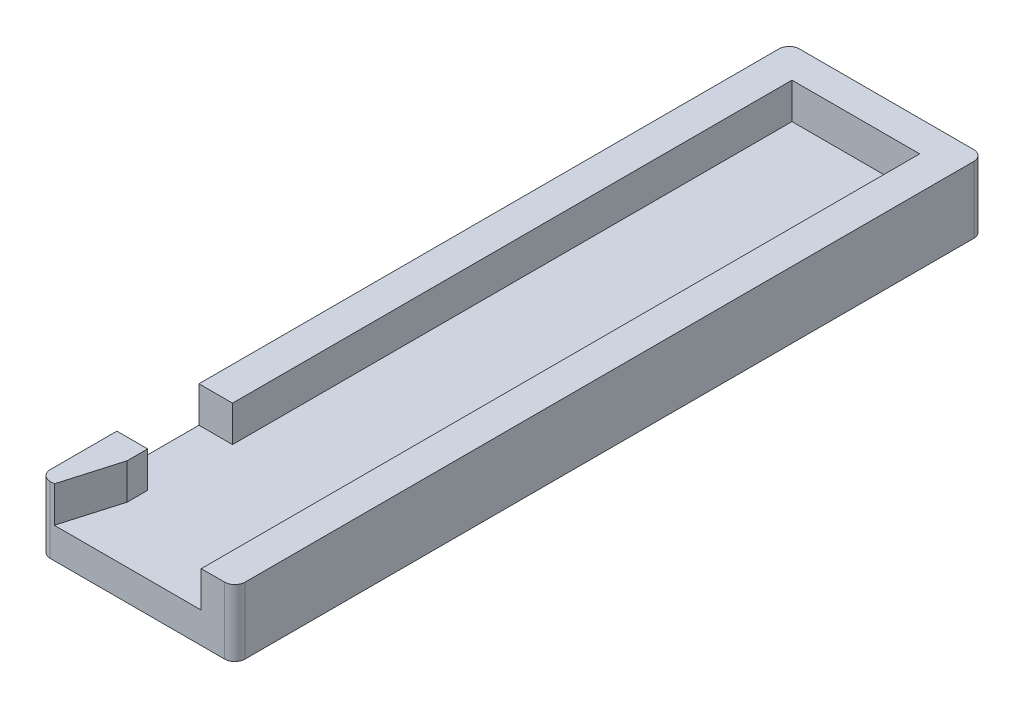
ISO-10303-21;
HEADER;
FILE_DESCRIPTION(('STEP AP214'),'2;1');
FILE_NAME('part.step','',(''),(''),'','','');
FILE_SCHEMA(('AUTOMOTIVE_DESIGN { 1 0 10303 214 1 1 1 1 }'));
ENDSEC;
DATA;
#1=APPLICATION_CONTEXT('core data for automotive mechanical design processes');
#2=APPLICATION_PROTOCOL_DEFINITION('international standard','automotive_design',2000,#1);
#3=PRODUCT_CONTEXT('',#1,'mechanical');
#4=PRODUCT('Part','Part','',(#3));
#5=PRODUCT_RELATED_PRODUCT_CATEGORY('part','',(#4));
#6=PRODUCT_DEFINITION_FORMATION('','',#4);
#7=PRODUCT_DEFINITION_CONTEXT('part definition',#1,'design');
#8=PRODUCT_DEFINITION('design','',#6,#7);
#9=PRODUCT_DEFINITION_SHAPE('','',#8);
#10=(LENGTH_UNIT() NAMED_UNIT(*) SI_UNIT(.MILLI.,.METRE.));
#11=(NAMED_UNIT(*) PLANE_ANGLE_UNIT() SI_UNIT($,.RADIAN.));
#12=(NAMED_UNIT(*) SI_UNIT($,.STERADIAN.) SOLID_ANGLE_UNIT());
#13=UNCERTAINTY_MEASURE_WITH_UNIT(LENGTH_MEASURE(1.E-05),#10,'distance_accuracy_value','');
#14=(GEOMETRIC_REPRESENTATION_CONTEXT(3) GLOBAL_UNCERTAINTY_ASSIGNED_CONTEXT((#13)) GLOBAL_UNIT_ASSIGNED_CONTEXT((#10,
#11,#12)) REPRESENTATION_CONTEXT('',''));
#15=CARTESIAN_POINT('',(0.,0.,0.));
#16=DIRECTION('',(0.,0.,1.));
#17=DIRECTION('',(1.,0.,0.));
#18=AXIS2_PLACEMENT_3D('',#15,#16,#17);
#19=CARTESIAN_POINT('',(0.,3.,0.));
#20=DIRECTION('',(0.,1.,0.));
#21=DIRECTION('',(0.,0.,1.));
#22=AXIS2_PLACEMENT_3D('',#19,#20,#21);
#23=PLANE('',#22);
#24=DIRECTION('',(0.,0.,-1.));
#25=VECTOR('',#24,1.);
#26=CARTESIAN_POINT('',(3.275,3.,-15.5));
#27=LINE('',#26,#25);
#28=CARTESIAN_POINT('',(3.275,3.,-15.5));
#29=VERTEX_POINT('',#28);
#30=CARTESIAN_POINT('',(3.275,3.,-70.05));
#31=VERTEX_POINT('',#30);
#32=EDGE_CURVE('E324',#29,#31,#27,.T.);
#33=ORIENTED_EDGE('',*,*,#32,.F.);
#34=DIRECTION('',(1.,0.,0.));
#35=VECTOR('',#34,1.);
#36=CARTESIAN_POINT('',(0.,3.,-15.5));
#37=LINE('',#36,#35);
#38=CARTESIAN_POINT('',(0.,3.,-15.5));
#39=VERTEX_POINT('',#38);
#40=EDGE_CURVE('E234',#39,#29,#37,.T.);
#41=ORIENTED_EDGE('',*,*,#40,.F.);
#42=DIRECTION('',(0.,0.,1.));
#43=VECTOR('',#42,1.);
#44=CARTESIAN_POINT('',(0.,3.,-73.05));
#45=LINE('',#44,#43);
#46=CARTESIAN_POINT('',(0.,3.,-7.50000000000001));
#47=VERTEX_POINT('',#46);
#48=EDGE_CURVE('E257',#39,#47,#45,.T.);
#49=ORIENTED_EDGE('',*,*,#48,.T.);
#50=DIRECTION('',(-1.,0.,0.));
#51=VECTOR('',#50,1.);
#52=CARTESIAN_POINT('',(3.,3.,-7.5));
#53=LINE('',#52,#51);
#54=CARTESIAN_POINT('',(3.,3.,-7.5));
#55=VERTEX_POINT('',#54);
#56=EDGE_CURVE('E216',#55,#47,#53,.T.);
#57=ORIENTED_EDGE('',*,*,#56,.F.);
#58=DIRECTION('',(0.,0.,-1.));
#59=VECTOR('',#58,1.);
#60=CARTESIAN_POINT('',(3.,3.,-5.5));
#61=LINE('',#60,#59);
#62=CARTESIAN_POINT('',(3.,3.,-5.5));
#63=VERTEX_POINT('',#62);
#64=EDGE_CURVE('E233',#63,#55,#61,.T.);
#65=ORIENTED_EDGE('',*,*,#64,.F.);
#66=DIRECTION('',(0.279329540830131,0.,-0.960195296603575));
#67=VECTOR('',#66,1.);
#68=CARTESIAN_POINT('',(1.4,3.,0.));
#69=LINE('',#68,#67);
#70=CARTESIAN_POINT('',(1.4,3.,0.));
#71=VERTEX_POINT('',#70);
#72=EDGE_CURVE('E229',#71,#63,#69,.T.);
#73=ORIENTED_EDGE('',*,*,#72,.F.);
#74=DIRECTION('',(1.,0.,0.));
#75=VECTOR('',#74,1.);
#76=CARTESIAN_POINT('',(0.,3.,0.));
#77=LINE('',#76,#75);
#78=CARTESIAN_POINT('',(15.725,3.,0.));
#79=VERTEX_POINT('',#78);
#80=EDGE_CURVE('E260',#71,#79,#77,.T.);
#81=ORIENTED_EDGE('',*,*,#80,.T.);
#82=DIRECTION('',(0.,0.,1.));
#83=VECTOR('',#82,1.);
#84=CARTESIAN_POINT('',(15.725,3.,-70.05));
#85=LINE('',#84,#83);
#86=CARTESIAN_POINT('',(15.725,3.,-70.05));
#87=VERTEX_POINT('',#86);
#88=EDGE_CURVE('E184',#87,#79,#85,.T.);
#89=ORIENTED_EDGE('',*,*,#88,.F.);
#90=DIRECTION('',(1.,0.,0.));
#91=VECTOR('',#90,1.);
#92=CARTESIAN_POINT('',(3.275,3.,-70.05));
#93=LINE('',#92,#91);
#94=EDGE_CURVE('E328',#31,#87,#93,.T.);
#95=ORIENTED_EDGE('',*,*,#94,.F.);
#96=EDGE_LOOP('',(#33,#41,#49,#57,#65,#73,#81,#89,#95));
#97=FACE_BOUND('',#96,.T.);
#98=ADVANCED_FACE('F45',(#97),#23,.T.);
#99=CARTESIAN_POINT('',(0.,3.,-73.05));
#100=DIRECTION('',(1.,0.,0.));
#101=DIRECTION('',(0.,0.,-1.));
#102=AXIS2_PLACEMENT_3D('',#99,#100,#101);
#103=PLANE('',#102);
#104=DIRECTION('',(0.,0.,1.));
#105=VECTOR('',#104,1.);
#106=CARTESIAN_POINT('',(0.,6.5,-73.05));
#107=LINE('',#106,#105);
#108=CARTESIAN_POINT('',(0.,6.5,-72.05));
#109=VERTEX_POINT('',#108);
#110=CARTESIAN_POINT('',(0.,6.5,-15.5));
#111=VERTEX_POINT('',#110);
#112=EDGE_CURVE('E209',#109,#111,#107,.T.);
#113=ORIENTED_EDGE('',*,*,#112,.F.);
#114=DIRECTION('',(0.,-1.,0.));
#115=VECTOR('',#114,1.);
#116=CARTESIAN_POINT('',(0.,3.,-72.05));
#117=LINE('',#116,#115);
#118=CARTESIAN_POINT('',(0.,0.,-72.05));
#119=VERTEX_POINT('',#118);
#120=EDGE_CURVE('E279',#109,#119,#117,.T.);
#121=ORIENTED_EDGE('',*,*,#120,.T.);
#122=DIRECTION('',(0.,0.,1.));
#123=VECTOR('',#122,1.);
#124=CARTESIAN_POINT('',(0.,0.,-73.05));
#125=LINE('',#124,#123);
#126=CARTESIAN_POINT('',(0.,0.,-1.));
#127=VERTEX_POINT('',#126);
#128=EDGE_CURVE('E256',#119,#127,#125,.T.);
#129=ORIENTED_EDGE('',*,*,#128,.T.);
#130=DIRECTION('',(0.,-1.,0.));
#131=VECTOR('',#130,1.);
#132=CARTESIAN_POINT('',(0.,3.,-1.));
#133=LINE('',#132,#131);
#134=CARTESIAN_POINT('',(0.,6.5,-1.));
#135=VERTEX_POINT('',#134);
#136=EDGE_CURVE('E264',#127,#135,#133,.F.);
#137=ORIENTED_EDGE('',*,*,#136,.T.);
#138=DIRECTION('',(0.,0.,1.));
#139=VECTOR('',#138,1.);
#140=CARTESIAN_POINT('',(0.,6.5,-7.5));
#141=LINE('',#140,#139);
#142=CARTESIAN_POINT('',(0.,6.5,-7.5));
#143=VERTEX_POINT('',#142);
#144=EDGE_CURVE('E225',#143,#135,#141,.T.);
#145=ORIENTED_EDGE('',*,*,#144,.F.);
#146=DIRECTION('',(0.,-1.,0.));
#147=VECTOR('',#146,1.);
#148=CARTESIAN_POINT('',(0.,6.5,-7.5));
#149=LINE('',#148,#147);
#150=EDGE_CURVE('E228',#143,#47,#149,.T.);
#151=ORIENTED_EDGE('',*,*,#150,.T.);
#152=ORIENTED_EDGE('',*,*,#48,.F.);
#153=DIRECTION('',(0.,-1.,0.));
#154=VECTOR('',#153,1.);
#155=CARTESIAN_POINT('',(0.,6.5,-15.5));
#156=LINE('',#155,#154);
#157=EDGE_CURVE('E374',#111,#39,#156,.T.);
#158=ORIENTED_EDGE('',*,*,#157,.F.);
#159=EDGE_LOOP('',(#113,#121,#129,#137,#145,#151,#152,#158));
#160=FACE_BOUND('',#159,.T.);
#161=ADVANCED_FACE('F348',(#160),#103,.F.);
#162=CARTESIAN_POINT('',(12.,3.,0.));
#163=DIRECTION('',(0.,0.,-1.));
#164=DIRECTION('',(-1.,0.,0.));
#165=AXIS2_PLACEMENT_3D('',#162,#163,#164);
#166=PLANE('',#165);
#167=DIRECTION('',(1.,0.,0.));
#168=VECTOR('',#167,1.);
#169=CARTESIAN_POINT('',(12.,0.,0.));
#170=LINE('',#169,#168);
#171=CARTESIAN_POINT('',(1.,0.,0.));
#172=VERTEX_POINT('',#171);
#173=CARTESIAN_POINT('',(18.,0.,0.));
#174=VERTEX_POINT('',#173);
#175=EDGE_CURVE('E268',#172,#174,#170,.T.);
#176=ORIENTED_EDGE('',*,*,#175,.T.);
#177=DIRECTION('',(0.,-1.,0.));
#178=VECTOR('',#177,1.);
#179=CARTESIAN_POINT('',(18.,3.,0.));
#180=LINE('',#179,#178);
#181=CARTESIAN_POINT('',(18.,6.5,0.));
#182=VERTEX_POINT('',#181);
#183=EDGE_CURVE('E54',#174,#182,#180,.F.);
#184=ORIENTED_EDGE('',*,*,#183,.T.);
#185=DIRECTION('',(1.,0.,0.));
#186=VECTOR('',#185,1.);
#187=CARTESIAN_POINT('',(15.725,6.5,0.));
#188=LINE('',#187,#186);
#189=CARTESIAN_POINT('',(15.725,6.5,0.));
#190=VERTEX_POINT('',#189);
#191=EDGE_CURVE('E171',#190,#182,#188,.T.);
#192=ORIENTED_EDGE('',*,*,#191,.F.);
#193=DIRECTION('',(0.,-1.,0.));
#194=VECTOR('',#193,1.);
#195=CARTESIAN_POINT('',(15.725,6.5,0.));
#196=LINE('',#195,#194);
#197=EDGE_CURVE('E182',#190,#79,#196,.T.);
#198=ORIENTED_EDGE('',*,*,#197,.T.);
#199=ORIENTED_EDGE('',*,*,#80,.F.);
#200=DIRECTION('',(0.,-1.,0.));
#201=VECTOR('',#200,1.);
#202=CARTESIAN_POINT('',(1.4,6.5,0.));
#203=LINE('',#202,#201);
#204=CARTESIAN_POINT('',(1.4,6.5,0.));
#205=VERTEX_POINT('',#204);
#206=EDGE_CURVE('E252',#205,#71,#203,.T.);
#207=ORIENTED_EDGE('',*,*,#206,.F.);
#208=DIRECTION('',(1.,0.,0.));
#209=VECTOR('',#208,1.);
#210=CARTESIAN_POINT('',(0.,6.5,0.));
#211=LINE('',#210,#209);
#212=CARTESIAN_POINT('',(1.,6.5,0.));
#213=VERTEX_POINT('',#212);
#214=EDGE_CURVE('E212',#213,#205,#211,.T.);
#215=ORIENTED_EDGE('',*,*,#214,.F.);
#216=DIRECTION('',(0.,-1.,0.));
#217=VECTOR('',#216,1.);
#218=CARTESIAN_POINT('',(1.,3.,0.));
#219=LINE('',#218,#217);
#220=EDGE_CURVE('E317',#213,#172,#219,.T.);
#221=ORIENTED_EDGE('',*,*,#220,.T.);
#222=EDGE_LOOP('',(#176,#184,#192,#198,#199,#207,#215,#221));
#223=FACE_BOUND('',#222,.T.);
#224=ADVANCED_FACE('F192',(#223),#166,.F.);
#225=CARTESIAN_POINT('',(19.,3.,0.));
#226=DIRECTION('',(-1.,0.,0.));
#227=DIRECTION('',(0.,0.,1.));
#228=AXIS2_PLACEMENT_3D('',#225,#226,#227);
#229=PLANE('',#228);
#230=DIRECTION('',(0.,0.,-1.));
#231=VECTOR('',#230,1.);
#232=CARTESIAN_POINT('',(19.,0.,0.));
#233=LINE('',#232,#231);
#234=CARTESIAN_POINT('',(19.,0.,-1.));
#235=VERTEX_POINT('',#234);
#236=CARTESIAN_POINT('',(19.,0.,-72.05));
#237=VERTEX_POINT('',#236);
#238=EDGE_CURVE('E271',#235,#237,#233,.T.);
#239=ORIENTED_EDGE('',*,*,#238,.T.);
#240=DIRECTION('',(0.,-1.,0.));
#241=VECTOR('',#240,1.);
#242=CARTESIAN_POINT('',(19.,3.,-72.05));
#243=LINE('',#242,#241);
#244=CARTESIAN_POINT('',(19.,6.5,-72.05));
#245=VERTEX_POINT('',#244);
#246=EDGE_CURVE('E67',#237,#245,#243,.F.);
#247=ORIENTED_EDGE('',*,*,#246,.T.);
#248=DIRECTION('',(0.,0.,-1.));
#249=VECTOR('',#248,1.);
#250=CARTESIAN_POINT('',(19.,6.5,0.));
#251=LINE('',#250,#249);
#252=CARTESIAN_POINT('',(19.,6.5,-1.));
#253=VERTEX_POINT('',#252);
#254=EDGE_CURVE('E195',#253,#245,#251,.T.);
#255=ORIENTED_EDGE('',*,*,#254,.F.);
#256=DIRECTION('',(0.,-1.,0.));
#257=VECTOR('',#256,1.);
#258=CARTESIAN_POINT('',(19.,3.,-1.));
#259=LINE('',#258,#257);
#260=EDGE_CURVE('E311',#253,#235,#259,.T.);
#261=ORIENTED_EDGE('',*,*,#260,.T.);
#262=EDGE_LOOP('',(#239,#247,#255,#261));
#263=FACE_BOUND('',#262,.T.);
#264=ADVANCED_FACE('F420',(#263),#229,.F.);
#265=CARTESIAN_POINT('',(19.,3.,-73.05));
#266=DIRECTION('',(0.,0.,1.));
#267=DIRECTION('',(1.,0.,0.));
#268=AXIS2_PLACEMENT_3D('',#265,#266,#267);
#269=PLANE('',#268);
#270=DIRECTION('',(-1.,0.,0.));
#271=VECTOR('',#270,1.);
#272=CARTESIAN_POINT('',(19.,0.,-73.05));
#273=LINE('',#272,#271);
#274=CARTESIAN_POINT('',(18.,0.,-73.05));
#275=VERTEX_POINT('',#274);
#276=CARTESIAN_POINT('',(1.,0.,-73.05));
#277=VERTEX_POINT('',#276);
#278=EDGE_CURVE('E261',#275,#277,#273,.T.);
#279=ORIENTED_EDGE('',*,*,#278,.T.);
#280=DIRECTION('',(0.,-1.,0.));
#281=VECTOR('',#280,1.);
#282=CARTESIAN_POINT('',(1.,3.,-73.05));
#283=LINE('',#282,#281);
#284=CARTESIAN_POINT('',(1.,6.5,-73.05));
#285=VERTEX_POINT('',#284);
#286=EDGE_CURVE('E299',#277,#285,#283,.F.);
#287=ORIENTED_EDGE('',*,*,#286,.T.);
#288=DIRECTION('',(-1.,0.,0.));
#289=VECTOR('',#288,1.);
#290=CARTESIAN_POINT('',(19.,6.5,-73.05));
#291=LINE('',#290,#289);
#292=CARTESIAN_POINT('',(18.,6.5,-73.05));
#293=VERTEX_POINT('',#292);
#294=EDGE_CURVE('E188',#293,#285,#291,.T.);
#295=ORIENTED_EDGE('',*,*,#294,.F.);
#296=DIRECTION('',(0.,-1.,0.));
#297=VECTOR('',#296,1.);
#298=CARTESIAN_POINT('',(18.,3.,-73.05));
#299=LINE('',#298,#297);
#300=EDGE_CURVE('E295',#293,#275,#299,.T.);
#301=ORIENTED_EDGE('',*,*,#300,.T.);
#302=EDGE_LOOP('',(#279,#287,#295,#301));
#303=FACE_BOUND('',#302,.T.);
#304=ADVANCED_FACE('F417',(#303),#269,.F.);
#305=CARTESIAN_POINT('',(0.,0.,0.));
#306=DIRECTION('',(0.,1.,0.));
#307=DIRECTION('',(0.,0.,1.));
#308=AXIS2_PLACEMENT_3D('',#305,#306,#307);
#309=PLANE('',#308);
#310=ORIENTED_EDGE('',*,*,#128,.F.);
#311=CARTESIAN_POINT('',(1.,0.,-72.05));
#312=DIRECTION('',(0.,1.,0.));
#313=DIRECTION('',(0.,0.,1.));
#314=AXIS2_PLACEMENT_3D('',#311,#312,#313);
#315=CIRCLE('',#314,1.);
#316=EDGE_CURVE('E292',#119,#277,#315,.F.);
#317=ORIENTED_EDGE('',*,*,#316,.T.);
#318=ORIENTED_EDGE('',*,*,#278,.F.);
#319=CARTESIAN_POINT('',(18.,0.,-72.05));
#320=DIRECTION('',(0.,1.,0.));
#321=DIRECTION('',(0.,0.,1.));
#322=AXIS2_PLACEMENT_3D('',#319,#320,#321);
#323=CIRCLE('',#322,1.);
#324=EDGE_CURVE('E289',#275,#237,#323,.F.);
#325=ORIENTED_EDGE('',*,*,#324,.T.);
#326=ORIENTED_EDGE('',*,*,#238,.F.);
#327=CARTESIAN_POINT('',(18.,0.,-1.));
#328=DIRECTION('',(0.,1.,0.));
#329=DIRECTION('',(0.,0.,1.));
#330=AXIS2_PLACEMENT_3D('',#327,#328,#329);
#331=CIRCLE('',#330,1.);
#332=EDGE_CURVE('E286',#235,#174,#331,.F.);
#333=ORIENTED_EDGE('',*,*,#332,.T.);
#334=ORIENTED_EDGE('',*,*,#175,.F.);
#335=CARTESIAN_POINT('',(1.,0.,-1.));
#336=DIRECTION('',(0.,1.,0.));
#337=DIRECTION('',(0.,0.,1.));
#338=AXIS2_PLACEMENT_3D('',#335,#336,#337);
#339=CIRCLE('',#338,1.);
#340=EDGE_CURVE('E283',#172,#127,#339,.F.);
#341=ORIENTED_EDGE('',*,*,#340,.T.);
#342=EDGE_LOOP('',(#310,#317,#318,#325,#326,#333,#334,#341));
#343=FACE_BOUND('',#342,.T.);
#344=ADVANCED_FACE('F352',(#343),#309,.F.);
#345=CARTESIAN_POINT('',(1.4,6.5,0.));
#346=DIRECTION('',(-0.960195296603575,0.,-0.279329540830131));
#347=DIRECTION('',(-0.279329540830131,0.,0.960195296603575));
#348=AXIS2_PLACEMENT_3D('',#345,#346,#347);
#349=PLANE('',#348);
#350=ORIENTED_EDGE('',*,*,#72,.T.);
#351=DIRECTION('',(0.,-1.,0.));
#352=VECTOR('',#351,1.);
#353=CARTESIAN_POINT('',(3.,6.5,-5.5));
#354=LINE('',#353,#352);
#355=CARTESIAN_POINT('',(3.,6.5,-5.5));
#356=VERTEX_POINT('',#355);
#357=EDGE_CURVE('E248',#356,#63,#354,.T.);
#358=ORIENTED_EDGE('',*,*,#357,.F.);
#359=DIRECTION('',(0.279329540830131,0.,-0.960195296603575));
#360=VECTOR('',#359,1.);
#361=CARTESIAN_POINT('',(1.4,6.5,0.));
#362=LINE('',#361,#360);
#363=EDGE_CURVE('E215',#205,#356,#362,.T.);
#364=ORIENTED_EDGE('',*,*,#363,.F.);
#365=ORIENTED_EDGE('',*,*,#206,.T.);
#366=EDGE_LOOP('',(#350,#358,#364,#365));
#367=FACE_BOUND('',#366,.T.);
#368=ADVANCED_FACE('F362',(#367),#349,.F.);
#369=CARTESIAN_POINT('',(3.,6.5,-5.5));
#370=DIRECTION('',(-1.,0.,0.));
#371=DIRECTION('',(0.,0.,1.));
#372=AXIS2_PLACEMENT_3D('',#369,#370,#371);
#373=PLANE('',#372);
#374=ORIENTED_EDGE('',*,*,#64,.T.);
#375=DIRECTION('',(0.,-1.,0.));
#376=VECTOR('',#375,1.);
#377=CARTESIAN_POINT('',(3.,6.5,-7.5));
#378=LINE('',#377,#376);
#379=CARTESIAN_POINT('',(3.,6.5,-7.5));
#380=VERTEX_POINT('',#379);
#381=EDGE_CURVE('E244',#380,#55,#378,.T.);
#382=ORIENTED_EDGE('',*,*,#381,.F.);
#383=DIRECTION('',(0.,0.,-1.));
#384=VECTOR('',#383,1.);
#385=CARTESIAN_POINT('',(3.,6.5,-5.5));
#386=LINE('',#385,#384);
#387=EDGE_CURVE('E219',#356,#380,#386,.T.);
#388=ORIENTED_EDGE('',*,*,#387,.F.);
#389=ORIENTED_EDGE('',*,*,#357,.T.);
#390=EDGE_LOOP('',(#374,#382,#388,#389));
#391=FACE_BOUND('',#390,.T.);
#392=ADVANCED_FACE('F366',(#391),#373,.F.);
#393=CARTESIAN_POINT('',(3.,6.5,-7.5));
#394=DIRECTION('',(0.,0.,1.));
#395=DIRECTION('',(1.,0.,0.));
#396=AXIS2_PLACEMENT_3D('',#393,#394,#395);
#397=PLANE('',#396);
#398=ORIENTED_EDGE('',*,*,#56,.T.);
#399=ORIENTED_EDGE('',*,*,#150,.F.);
#400=DIRECTION('',(-1.,0.,0.));
#401=VECTOR('',#400,1.);
#402=CARTESIAN_POINT('',(3.,6.5,-7.5));
#403=LINE('',#402,#401);
#404=EDGE_CURVE('E222',#380,#143,#403,.T.);
#405=ORIENTED_EDGE('',*,*,#404,.F.);
#406=ORIENTED_EDGE('',*,*,#381,.T.);
#407=EDGE_LOOP('',(#398,#399,#405,#406));
#408=FACE_BOUND('',#407,.T.);
#409=ADVANCED_FACE('F371',(#408),#397,.F.);
#410=CARTESIAN_POINT('',(0.,6.5,0.));
#411=DIRECTION('',(0.,1.,0.));
#412=DIRECTION('',(0.,0.,1.));
#413=AXIS2_PLACEMENT_3D('',#410,#411,#412);
#414=PLANE('',#413);
#415=ORIENTED_EDGE('',*,*,#144,.T.);
#416=CARTESIAN_POINT('',(1.,6.5,-1.));
#417=DIRECTION('',(0.,1.,0.));
#418=DIRECTION('',(0.,0.,1.));
#419=AXIS2_PLACEMENT_3D('',#416,#417,#418);
#420=CIRCLE('',#419,1.);
#421=EDGE_CURVE('E11',#135,#213,#420,.T.);
#422=ORIENTED_EDGE('',*,*,#421,.T.);
#423=ORIENTED_EDGE('',*,*,#214,.T.);
#424=ORIENTED_EDGE('',*,*,#363,.T.);
#425=ORIENTED_EDGE('',*,*,#387,.T.);
#426=ORIENTED_EDGE('',*,*,#404,.T.);
#427=EDGE_LOOP('',(#415,#422,#423,#424,#425,#426));
#428=FACE_BOUND('',#427,.T.);
#429=ADVANCED_FACE('F359',(#428),#414,.T.);
#430=CARTESIAN_POINT('',(0.,6.5,-15.5));
#431=DIRECTION('',(0.,0.,-1.));
#432=DIRECTION('',(-1.,0.,0.));
#433=AXIS2_PLACEMENT_3D('',#430,#431,#432);
#434=PLANE('',#433);
#435=ORIENTED_EDGE('',*,*,#40,.T.);
#436=DIRECTION('',(0.,-1.,0.));
#437=VECTOR('',#436,1.);
#438=CARTESIAN_POINT('',(3.275,6.5,-15.5));
#439=LINE('',#438,#437);
#440=CARTESIAN_POINT('',(3.275,6.5,-15.5));
#441=VERTEX_POINT('',#440);
#442=EDGE_CURVE('E382',#441,#29,#439,.T.);
#443=ORIENTED_EDGE('',*,*,#442,.F.);
#444=DIRECTION('',(1.,0.,0.));
#445=VECTOR('',#444,1.);
#446=CARTESIAN_POINT('',(0.,6.5,-15.5));
#447=LINE('',#446,#445);
#448=EDGE_CURVE('E206',#111,#441,#447,.T.);
#449=ORIENTED_EDGE('',*,*,#448,.F.);
#450=ORIENTED_EDGE('',*,*,#157,.T.);
#451=EDGE_LOOP('',(#435,#443,#449,#450));
#452=FACE_BOUND('',#451,.T.);
#453=ADVANCED_FACE('F378',(#452),#434,.F.);
#454=CARTESIAN_POINT('',(3.275,6.5,-15.5));
#455=DIRECTION('',(-1.,0.,0.));
#456=DIRECTION('',(0.,0.,1.));
#457=AXIS2_PLACEMENT_3D('',#454,#455,#456);
#458=PLANE('',#457);
#459=ORIENTED_EDGE('',*,*,#32,.T.);
#460=DIRECTION('',(0.,-1.,0.));
#461=VECTOR('',#460,1.);
#462=CARTESIAN_POINT('',(3.275,6.5,-70.05));
#463=LINE('',#462,#461);
#464=CARTESIAN_POINT('',(3.275,6.5,-70.05));
#465=VERTEX_POINT('',#464);
#466=EDGE_CURVE('E385',#465,#31,#463,.T.);
#467=ORIENTED_EDGE('',*,*,#466,.F.);
#468=DIRECTION('',(0.,0.,-1.));
#469=VECTOR('',#468,1.);
#470=CARTESIAN_POINT('',(3.275,6.5,-15.5));
#471=LINE('',#470,#469);
#472=EDGE_CURVE('E203',#441,#465,#471,.T.);
#473=ORIENTED_EDGE('',*,*,#472,.F.);
#474=ORIENTED_EDGE('',*,*,#442,.T.);
#475=EDGE_LOOP('',(#459,#467,#473,#474));
#476=FACE_BOUND('',#475,.T.);
#477=ADVANCED_FACE('F395',(#476),#458,.F.);
#478=CARTESIAN_POINT('',(3.275,6.5,-70.05));
#479=DIRECTION('',(0.,0.,-1.));
#480=DIRECTION('',(-1.,0.,0.));
#481=AXIS2_PLACEMENT_3D('',#478,#479,#480);
#482=PLANE('',#481);
#483=ORIENTED_EDGE('',*,*,#94,.T.);
#484=DIRECTION('',(0.,-1.,0.));
#485=VECTOR('',#484,1.);
#486=CARTESIAN_POINT('',(15.725,6.5,-70.05));
#487=LINE('',#486,#485);
#488=CARTESIAN_POINT('',(15.725,6.5,-70.05));
#489=VERTEX_POINT('',#488);
#490=EDGE_CURVE('E189',#489,#87,#487,.T.);
#491=ORIENTED_EDGE('',*,*,#490,.F.);
#492=DIRECTION('',(1.,0.,0.));
#493=VECTOR('',#492,1.);
#494=CARTESIAN_POINT('',(3.275,6.5,-70.05));
#495=LINE('',#494,#493);
#496=EDGE_CURVE('E174',#465,#489,#495,.T.);
#497=ORIENTED_EDGE('',*,*,#496,.F.);
#498=ORIENTED_EDGE('',*,*,#466,.T.);
#499=EDGE_LOOP('',(#483,#491,#497,#498));
#500=FACE_BOUND('',#499,.T.);
#501=ADVANCED_FACE('F392',(#500),#482,.F.);
#502=CARTESIAN_POINT('',(15.725,6.5,-70.05));
#503=DIRECTION('',(1.,0.,0.));
#504=DIRECTION('',(0.,0.,-1.));
#505=AXIS2_PLACEMENT_3D('',#502,#503,#504);
#506=PLANE('',#505);
#507=ORIENTED_EDGE('',*,*,#88,.T.);
#508=ORIENTED_EDGE('',*,*,#197,.F.);
#509=DIRECTION('',(0.,0.,1.));
#510=VECTOR('',#509,1.);
#511=CARTESIAN_POINT('',(15.725,6.5,-70.05));
#512=LINE('',#511,#510);
#513=EDGE_CURVE('E166',#489,#190,#512,.T.);
#514=ORIENTED_EDGE('',*,*,#513,.F.);
#515=ORIENTED_EDGE('',*,*,#490,.T.);
#516=EDGE_LOOP('',(#507,#508,#514,#515));
#517=FACE_BOUND('',#516,.T.);
#518=ADVANCED_FACE('F183',(#517),#506,.F.);
#519=CARTESIAN_POINT('',(0.,6.5,0.));
#520=DIRECTION('',(0.,1.,0.));
#521=DIRECTION('',(0.,0.,1.));
#522=AXIS2_PLACEMENT_3D('',#519,#520,#521);
#523=PLANE('',#522);
#524=ORIENTED_EDGE('',*,*,#294,.T.);
#525=CARTESIAN_POINT('',(1.,6.5,-72.05));
#526=DIRECTION('',(0.,1.,0.));
#527=DIRECTION('',(0.,0.,1.));
#528=AXIS2_PLACEMENT_3D('',#525,#526,#527);
#529=CIRCLE('',#528,1.);
#530=EDGE_CURVE('E308',#285,#109,#529,.T.);
#531=ORIENTED_EDGE('',*,*,#530,.T.);
#532=ORIENTED_EDGE('',*,*,#112,.T.);
#533=ORIENTED_EDGE('',*,*,#448,.T.);
#534=ORIENTED_EDGE('',*,*,#472,.T.);
#535=ORIENTED_EDGE('',*,*,#496,.T.);
#536=ORIENTED_EDGE('',*,*,#513,.T.);
#537=ORIENTED_EDGE('',*,*,#191,.T.);
#538=CARTESIAN_POINT('',(18.,6.5,-1.));
#539=DIRECTION('',(0.,1.,0.));
#540=DIRECTION('',(0.,0.,1.));
#541=AXIS2_PLACEMENT_3D('',#538,#539,#540);
#542=CIRCLE('',#541,1.);
#543=EDGE_CURVE('E302',#182,#253,#542,.T.);
#544=ORIENTED_EDGE('',*,*,#543,.T.);
#545=ORIENTED_EDGE('',*,*,#254,.T.);
#546=CARTESIAN_POINT('',(18.,6.5,-72.05));
#547=DIRECTION('',(0.,1.,0.));
#548=DIRECTION('',(0.,0.,1.));
#549=AXIS2_PLACEMENT_3D('',#546,#547,#548);
#550=CIRCLE('',#549,1.);
#551=EDGE_CURVE('E305',#245,#293,#550,.T.);
#552=ORIENTED_EDGE('',*,*,#551,.T.);
#553=EDGE_LOOP('',(#524,#531,#532,#533,#534,#535,#536,#537,#544,#545,#552));
#554=FACE_BOUND('',#553,.T.);
#555=ADVANCED_FACE('F169',(#554),#523,.T.);
#556=CARTESIAN_POINT('',(1.,3.,-72.05));
#557=DIRECTION('',(0.,-1.,0.));
#558=DIRECTION('',(0.,0.,-1.));
#559=AXIS2_PLACEMENT_3D('',#556,#557,#558);
#560=CYLINDRICAL_SURFACE('',#559,1.);
#561=ORIENTED_EDGE('',*,*,#530,.F.);
#562=ORIENTED_EDGE('',*,*,#286,.F.);
#563=ORIENTED_EDGE('',*,*,#316,.F.);
#564=ORIENTED_EDGE('',*,*,#120,.F.);
#565=EDGE_LOOP('',(#561,#562,#563,#564));
#566=FACE_BOUND('',#565,.T.);
#567=ADVANCED_FACE('F345',(#566),#560,.T.);
#568=CARTESIAN_POINT('',(18.,3.,-72.05));
#569=DIRECTION('',(0.,-1.,0.));
#570=DIRECTION('',(0.,0.,-1.));
#571=AXIS2_PLACEMENT_3D('',#568,#569,#570);
#572=CYLINDRICAL_SURFACE('',#571,1.);
#573=ORIENTED_EDGE('',*,*,#551,.F.);
#574=ORIENTED_EDGE('',*,*,#246,.F.);
#575=ORIENTED_EDGE('',*,*,#324,.F.);
#576=ORIENTED_EDGE('',*,*,#300,.F.);
#577=EDGE_LOOP('',(#573,#574,#575,#576));
#578=FACE_BOUND('',#577,.T.);
#579=ADVANCED_FACE('F427',(#578),#572,.T.);
#580=CARTESIAN_POINT('',(18.,3.,-1.));
#581=DIRECTION('',(0.,-1.,0.));
#582=DIRECTION('',(0.,0.,-1.));
#583=AXIS2_PLACEMENT_3D('',#580,#581,#582);
#584=CYLINDRICAL_SURFACE('',#583,1.);
#585=ORIENTED_EDGE('',*,*,#543,.F.);
#586=ORIENTED_EDGE('',*,*,#183,.F.);
#587=ORIENTED_EDGE('',*,*,#332,.F.);
#588=ORIENTED_EDGE('',*,*,#260,.F.);
#589=EDGE_LOOP('',(#585,#586,#587,#588));
#590=FACE_BOUND('',#589,.T.);
#591=ADVANCED_FACE('F429',(#590),#584,.T.);
#592=CARTESIAN_POINT('',(1.,3.,-1.));
#593=DIRECTION('',(0.,-1.,0.));
#594=DIRECTION('',(0.,0.,-1.));
#595=AXIS2_PLACEMENT_3D('',#592,#593,#594);
#596=CYLINDRICAL_SURFACE('',#595,1.);
#597=ORIENTED_EDGE('',*,*,#421,.F.);
#598=ORIENTED_EDGE('',*,*,#136,.F.);
#599=ORIENTED_EDGE('',*,*,#340,.F.);
#600=ORIENTED_EDGE('',*,*,#220,.F.);
#601=EDGE_LOOP('',(#597,#598,#599,#600));
#602=FACE_BOUND('',#601,.T.);
#603=ADVANCED_FACE('F47',(#602),#596,.T.);
#604=CLOSED_SHELL('',(#98,#161,#224,#264,#304,#344,#368,#392,#409,#429,#453,#477,#501,#518,#555,
#567,#579,#591,#603));
#605=MANIFOLD_SOLID_BREP('B2',#604);
#606=ADVANCED_BREP_SHAPE_REPRESENTATION('',(#18,#605),#14);
#607=SHAPE_DEFINITION_REPRESENTATION(#9,#606);
ENDSEC;
END-ISO-10303-21;
